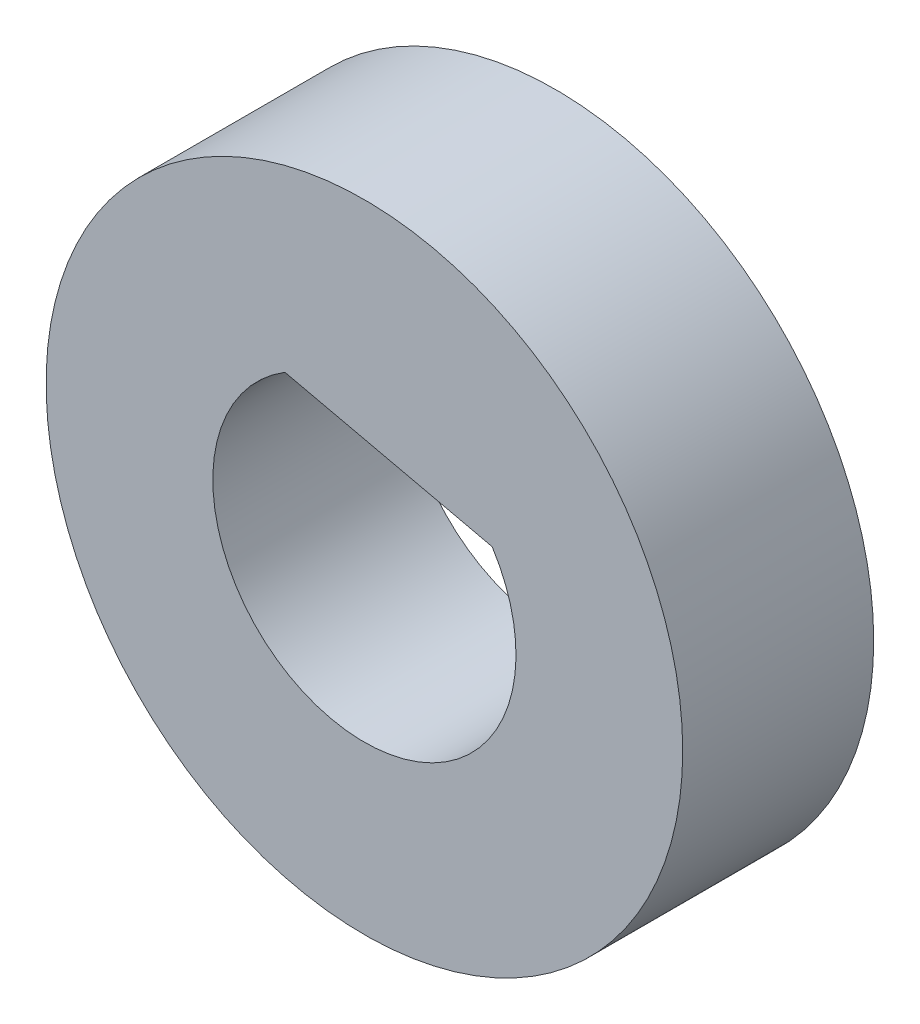
ISO-10303-21;
HEADER;
FILE_DESCRIPTION(('STEP AP214'),'2;1');
FILE_NAME('part.step','',(''),(''),'','','');
FILE_SCHEMA(('AUTOMOTIVE_DESIGN { 1 0 10303 214 1 1 1 1 }'));
ENDSEC;
DATA;
#1=APPLICATION_CONTEXT('core data for automotive mechanical design processes');
#2=APPLICATION_PROTOCOL_DEFINITION('international standard','automotive_design',2000,#1);
#3=PRODUCT_CONTEXT('',#1,'mechanical');
#4=PRODUCT('Part','Part','',(#3));
#5=PRODUCT_RELATED_PRODUCT_CATEGORY('part','',(#4));
#6=PRODUCT_DEFINITION_FORMATION('','',#4);
#7=PRODUCT_DEFINITION_CONTEXT('part definition',#1,'design');
#8=PRODUCT_DEFINITION('design','',#6,#7);
#9=PRODUCT_DEFINITION_SHAPE('','',#8);
#10=(LENGTH_UNIT() NAMED_UNIT(*) SI_UNIT(.MILLI.,.METRE.));
#11=(NAMED_UNIT(*) PLANE_ANGLE_UNIT() SI_UNIT($,.RADIAN.));
#12=(NAMED_UNIT(*) SI_UNIT($,.STERADIAN.) SOLID_ANGLE_UNIT());
#13=UNCERTAINTY_MEASURE_WITH_UNIT(LENGTH_MEASURE(1.E-05),#10,'distance_accuracy_value','');
#14=(GEOMETRIC_REPRESENTATION_CONTEXT(3) GLOBAL_UNCERTAINTY_ASSIGNED_CONTEXT((#13)) GLOBAL_UNIT_ASSIGNED_CONTEXT((#10,
#11,#12)) REPRESENTATION_CONTEXT('',''));
#15=CARTESIAN_POINT('',(0.,0.,0.));
#16=DIRECTION('',(0.,0.,1.));
#17=DIRECTION('',(1.,0.,0.));
#18=AXIS2_PLACEMENT_3D('',#15,#16,#17);
#19=CARTESIAN_POINT('',(0.,0.,3.));
#20=DIRECTION('',(0.,0.,-1.));
#21=DIRECTION('',(-1.,0.,0.));
#22=AXIS2_PLACEMENT_3D('',#19,#20,#21);
#23=CYLINDRICAL_SURFACE('',#22,5.);
#24=CARTESIAN_POINT('',(0.,0.,3.));
#25=DIRECTION('',(0.,0.,1.));
#26=DIRECTION('',(1.,0.,0.));
#27=AXIS2_PLACEMENT_3D('',#24,#25,#26);
#28=CIRCLE('',#27,5.);
#29=CARTESIAN_POINT('',(5.,0.,3.));
#30=VERTEX_POINT('',#29);
#31=EDGE_CURVE('E11',#30,#30,#28,.T.);
#32=ORIENTED_EDGE('',*,*,#31,.F.);
#33=EDGE_LOOP('',(#32));
#34=FACE_BOUND('',#33,.T.);
#35=CARTESIAN_POINT('',(0.,0.,0.));
#36=DIRECTION('',(0.,0.,1.));
#37=DIRECTION('',(1.,0.,0.));
#38=AXIS2_PLACEMENT_3D('',#35,#36,#37);
#39=CIRCLE('',#38,5.);
#40=CARTESIAN_POINT('',(5.,0.,0.));
#41=VERTEX_POINT('',#40);
#42=EDGE_CURVE('E36',#41,#41,#39,.T.);
#43=ORIENTED_EDGE('',*,*,#42,.T.);
#44=EDGE_LOOP('',(#43));
#45=FACE_BOUND('',#44,.T.);
#46=ADVANCED_FACE('F33',(#34,#45),#23,.T.);
#47=CARTESIAN_POINT('',(0.,0.,3.));
#48=DIRECTION('',(0.,0.,1.));
#49=DIRECTION('',(1.,0.,0.));
#50=AXIS2_PLACEMENT_3D('',#47,#48,#49);
#51=PLANE('',#50);
#52=CARTESIAN_POINT('',(0.,0.,3.));
#53=DIRECTION('',(0.,0.,1.));
#54=DIRECTION('',(1.,0.,0.));
#55=AXIS2_PLACEMENT_3D('',#52,#53,#54);
#56=CIRCLE('',#55,2.38125);
#57=CARTESIAN_POINT('',(-1.24923869858208,2.02725287925926,3.));
#58=VERTEX_POINT('',#57);
#59=CARTESIAN_POINT('',(2.00666826094724,1.2820429216711,3.));
#60=VERTEX_POINT('',#59);
#61=EDGE_CURVE('E47',#58,#60,#56,.T.);
#62=ORIENTED_EDGE('',*,*,#61,.F.);
#63=DIRECTION('',(0.974793257545978,-0.223110073826579,0.));
#64=VECTOR('',#63,1.);
#65=CARTESIAN_POINT('',(-1.24923869858208,2.02725287925926,3.));
#66=LINE('',#65,#64);
#67=EDGE_CURVE('E66',#58,#60,#66,.T.);
#68=ORIENTED_EDGE('',*,*,#67,.T.);
#69=EDGE_LOOP('',(#62,#68));
#70=FACE_BOUND('',#69,.T.);
#71=ORIENTED_EDGE('',*,*,#31,.T.);
#72=EDGE_LOOP('',(#71));
#73=FACE_BOUND('',#72,.T.);
#74=ADVANCED_FACE('F70',(#70,#73),#51,.T.);
#75=CARTESIAN_POINT('',(0.,0.,0.));
#76=DIRECTION('',(0.,0.,1.));
#77=DIRECTION('',(1.,0.,0.));
#78=AXIS2_PLACEMENT_3D('',#75,#76,#77);
#79=PLANE('',#78);
#80=DIRECTION('',(0.974793257545978,-0.223110073826579,0.));
#81=VECTOR('',#80,1.);
#82=CARTESIAN_POINT('',(-1.24923869858208,2.02725287925926,0.));
#83=LINE('',#82,#81);
#84=CARTESIAN_POINT('',(-1.24923869858208,2.02725287925926,0.));
#85=VERTEX_POINT('',#84);
#86=CARTESIAN_POINT('',(2.00666826094724,1.2820429216711,0.));
#87=VERTEX_POINT('',#86);
#88=EDGE_CURVE('E74',#85,#87,#83,.T.);
#89=ORIENTED_EDGE('',*,*,#88,.F.);
#90=CARTESIAN_POINT('',(0.,0.,0.));
#91=DIRECTION('',(0.,0.,1.));
#92=DIRECTION('',(1.,0.,0.));
#93=AXIS2_PLACEMENT_3D('',#90,#91,#92);
#94=CIRCLE('',#93,2.38125);
#95=EDGE_CURVE('E52',#85,#87,#94,.T.);
#96=ORIENTED_EDGE('',*,*,#95,.T.);
#97=EDGE_LOOP('',(#89,#96));
#98=FACE_BOUND('',#97,.T.);
#99=ORIENTED_EDGE('',*,*,#42,.F.);
#100=EDGE_LOOP('',(#99));
#101=FACE_BOUND('',#100,.T.);
#102=ADVANCED_FACE('F78',(#98,#101),#79,.F.);
#103=CARTESIAN_POINT('',(0.,0.,0.));
#104=DIRECTION('',(0.,0.,1.));
#105=DIRECTION('',(1.,0.,0.));
#106=AXIS2_PLACEMENT_3D('',#103,#104,#105);
#107=CYLINDRICAL_SURFACE('',#106,2.38125);
#108=ORIENTED_EDGE('',*,*,#61,.T.);
#109=DIRECTION('',(0.,0.,1.));
#110=VECTOR('',#109,1.);
#111=CARTESIAN_POINT('',(2.00666826094724,1.2820429216711,0.));
#112=LINE('',#111,#110);
#113=EDGE_CURVE('E63',#87,#60,#112,.T.);
#114=ORIENTED_EDGE('',*,*,#113,.F.);
#115=ORIENTED_EDGE('',*,*,#95,.F.);
#116=DIRECTION('',(0.,0.,1.));
#117=VECTOR('',#116,1.);
#118=CARTESIAN_POINT('',(-1.24923869858208,2.02725287925926,0.));
#119=LINE('',#118,#117);
#120=EDGE_CURVE('E58',#85,#58,#119,.T.);
#121=ORIENTED_EDGE('',*,*,#120,.T.);
#122=EDGE_LOOP('',(#108,#114,#115,#121));
#123=FACE_BOUND('',#122,.T.);
#124=ADVANCED_FACE('F60',(#123),#107,.F.);
#125=CARTESIAN_POINT('',(-1.24923869858208,2.02725287925926,0.));
#126=DIRECTION('',(-0.223110073826579,-0.974793257545978,0.));
#127=DIRECTION('',(0.974793257545978,-0.223110073826579,0.));
#128=AXIS2_PLACEMENT_3D('',#125,#126,#127);
#129=PLANE('',#128);
#130=ORIENTED_EDGE('',*,*,#67,.F.);
#131=ORIENTED_EDGE('',*,*,#120,.F.);
#132=ORIENTED_EDGE('',*,*,#88,.T.);
#133=ORIENTED_EDGE('',*,*,#113,.T.);
#134=EDGE_LOOP('',(#130,#131,#132,#133));
#135=FACE_BOUND('',#134,.T.);
#136=ADVANCED_FACE('F67',(#135),#129,.T.);
#137=CLOSED_SHELL('',(#46,#74,#102,#124,#136));
#138=MANIFOLD_SOLID_BREP('B2',#137);
#139=ADVANCED_BREP_SHAPE_REPRESENTATION('',(#18,#138),#14);
#140=SHAPE_DEFINITION_REPRESENTATION(#9,#139);
ENDSEC;
END-ISO-10303-21;
